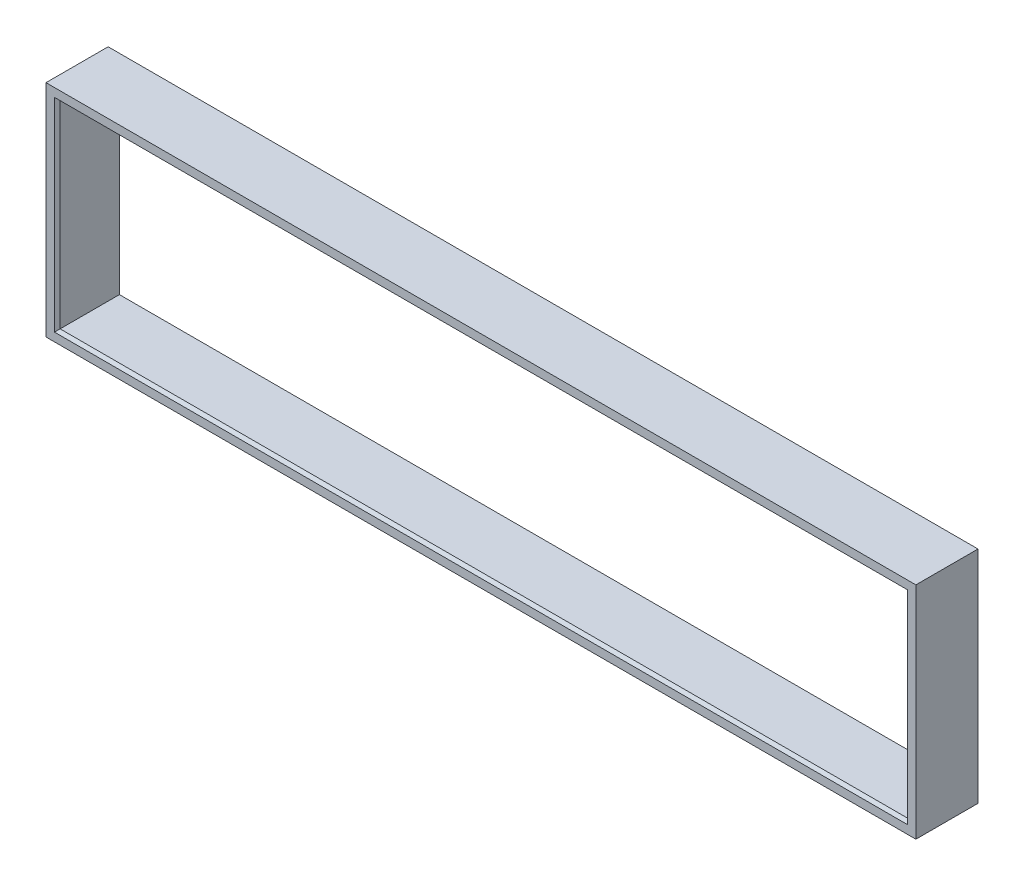
ISO-10303-21;
HEADER;
FILE_DESCRIPTION(('STEP AP214'),'2;1');
FILE_NAME('part.step','',(''),(''),'','','');
FILE_SCHEMA(('AUTOMOTIVE_DESIGN { 1 0 10303 214 1 1 1 1 }'));
ENDSEC;
DATA;
#1=APPLICATION_CONTEXT('core data for automotive mechanical design processes');
#2=APPLICATION_PROTOCOL_DEFINITION('international standard','automotive_design',2000,#1);
#3=PRODUCT_CONTEXT('',#1,'mechanical');
#4=PRODUCT('Part','Part','',(#3));
#5=PRODUCT_RELATED_PRODUCT_CATEGORY('part','',(#4));
#6=PRODUCT_DEFINITION_FORMATION('','',#4);
#7=PRODUCT_DEFINITION_CONTEXT('part definition',#1,'design');
#8=PRODUCT_DEFINITION('design','',#6,#7);
#9=PRODUCT_DEFINITION_SHAPE('','',#8);
#10=(LENGTH_UNIT() NAMED_UNIT(*) SI_UNIT(.MILLI.,.METRE.));
#11=(NAMED_UNIT(*) PLANE_ANGLE_UNIT() SI_UNIT($,.RADIAN.));
#12=(NAMED_UNIT(*) SI_UNIT($,.STERADIAN.) SOLID_ANGLE_UNIT());
#13=UNCERTAINTY_MEASURE_WITH_UNIT(LENGTH_MEASURE(1.E-05),#10,'distance_accuracy_value','');
#14=(GEOMETRIC_REPRESENTATION_CONTEXT(3) GLOBAL_UNCERTAINTY_ASSIGNED_CONTEXT((#13)) GLOBAL_UNIT_ASSIGNED_CONTEXT((#10,
#11,#12)) REPRESENTATION_CONTEXT('',''));
#15=CARTESIAN_POINT('',(0.,0.,0.));
#16=DIRECTION('',(0.,0.,1.));
#17=DIRECTION('',(1.,0.,0.));
#18=AXIS2_PLACEMENT_3D('',#15,#16,#17);
#19=CARTESIAN_POINT('',(-154.,39.,-20.));
#20=DIRECTION('',(-1.,0.,0.));
#21=DIRECTION('',(0.,0.,1.));
#22=AXIS2_PLACEMENT_3D('',#19,#20,#21);
#23=PLANE('',#22);
#24=DIRECTION('',(0.,0.,1.));
#25=VECTOR('',#24,1.);
#26=CARTESIAN_POINT('',(-154.,-39.,-20.));
#27=LINE('',#26,#25);
#28=CARTESIAN_POINT('',(-154.,-39.,-20.));
#29=VERTEX_POINT('',#28);
#30=CARTESIAN_POINT('',(-154.,-39.,2.));
#31=VERTEX_POINT('',#30);
#32=EDGE_CURVE('E113',#29,#31,#27,.T.);
#33=ORIENTED_EDGE('',*,*,#32,.T.);
#34=DIRECTION('',(0.,-1.,0.));
#35=VECTOR('',#34,1.);
#36=CARTESIAN_POINT('',(-154.,39.,2.));
#37=LINE('',#36,#35);
#38=CARTESIAN_POINT('',(-154.,39.,2.));
#39=VERTEX_POINT('',#38);
#40=EDGE_CURVE('E116',#39,#31,#37,.T.);
#41=ORIENTED_EDGE('',*,*,#40,.F.);
#42=DIRECTION('',(0.,0.,1.));
#43=VECTOR('',#42,1.);
#44=CARTESIAN_POINT('',(-154.,39.,-20.));
#45=LINE('',#44,#43);
#46=CARTESIAN_POINT('',(-154.,39.,-20.));
#47=VERTEX_POINT('',#46);
#48=EDGE_CURVE('E172',#47,#39,#45,.T.);
#49=ORIENTED_EDGE('',*,*,#48,.F.);
#50=DIRECTION('',(0.,-1.,0.));
#51=VECTOR('',#50,1.);
#52=CARTESIAN_POINT('',(-154.,39.,-20.));
#53=LINE('',#52,#51);
#54=EDGE_CURVE('E118',#47,#29,#53,.T.);
#55=ORIENTED_EDGE('',*,*,#54,.T.);
#56=EDGE_LOOP('',(#33,#41,#49,#55));
#57=FACE_BOUND('',#56,.T.);
#58=ADVANCED_FACE('F34',(#57),#23,.T.);
#59=CARTESIAN_POINT('',(-154.,39.,-20.));
#60=DIRECTION('',(0.,1.,0.));
#61=DIRECTION('',(0.,0.,1.));
#62=AXIS2_PLACEMENT_3D('',#59,#60,#61);
#63=PLANE('',#62);
#64=ORIENTED_EDGE('',*,*,#48,.T.);
#65=DIRECTION('',(-1.,0.,0.));
#66=VECTOR('',#65,1.);
#67=CARTESIAN_POINT('',(-154.,39.,2.));
#68=LINE('',#67,#66);
#69=CARTESIAN_POINT('',(154.,39.,2.));
#70=VERTEX_POINT('',#69);
#71=EDGE_CURVE('E136',#70,#39,#68,.T.);
#72=ORIENTED_EDGE('',*,*,#71,.F.);
#73=DIRECTION('',(0.,0.,1.));
#74=VECTOR('',#73,1.);
#75=CARTESIAN_POINT('',(154.,39.,-20.));
#76=LINE('',#75,#74);
#77=CARTESIAN_POINT('',(154.,39.,-20.));
#78=VERTEX_POINT('',#77);
#79=EDGE_CURVE('E175',#78,#70,#76,.T.);
#80=ORIENTED_EDGE('',*,*,#79,.F.);
#81=DIRECTION('',(-1.,0.,0.));
#82=VECTOR('',#81,1.);
#83=CARTESIAN_POINT('',(-154.,39.,-20.));
#84=LINE('',#83,#82);
#85=EDGE_CURVE('E123',#78,#47,#84,.T.);
#86=ORIENTED_EDGE('',*,*,#85,.T.);
#87=EDGE_LOOP('',(#64,#72,#80,#86));
#88=FACE_BOUND('',#87,.T.);
#89=ADVANCED_FACE('F232',(#88),#63,.T.);
#90=CARTESIAN_POINT('',(154.,39.,-20.));
#91=DIRECTION('',(1.,0.,0.));
#92=DIRECTION('',(0.,0.,-1.));
#93=AXIS2_PLACEMENT_3D('',#90,#91,#92);
#94=PLANE('',#93);
#95=ORIENTED_EDGE('',*,*,#79,.T.);
#96=DIRECTION('',(0.,1.,0.));
#97=VECTOR('',#96,1.);
#98=CARTESIAN_POINT('',(154.,39.,2.));
#99=LINE('',#98,#97);
#100=CARTESIAN_POINT('',(154.,-39.,2.));
#101=VERTEX_POINT('',#100);
#102=EDGE_CURVE('E131',#101,#70,#99,.T.);
#103=ORIENTED_EDGE('',*,*,#102,.F.);
#104=DIRECTION('',(0.,0.,1.));
#105=VECTOR('',#104,1.);
#106=CARTESIAN_POINT('',(154.,-39.,-20.));
#107=LINE('',#106,#105);
#108=CARTESIAN_POINT('',(154.,-39.,-20.));
#109=VERTEX_POINT('',#108);
#110=EDGE_CURVE('E122',#109,#101,#107,.T.);
#111=ORIENTED_EDGE('',*,*,#110,.F.);
#112=DIRECTION('',(0.,1.,0.));
#113=VECTOR('',#112,1.);
#114=CARTESIAN_POINT('',(154.,39.,-20.));
#115=LINE('',#114,#113);
#116=EDGE_CURVE('E167',#109,#78,#115,.T.);
#117=ORIENTED_EDGE('',*,*,#116,.T.);
#118=EDGE_LOOP('',(#95,#103,#111,#117));
#119=FACE_BOUND('',#118,.T.);
#120=ADVANCED_FACE('F237',(#119),#94,.T.);
#121=CARTESIAN_POINT('',(-154.,-39.,-20.));
#122=DIRECTION('',(0.,-1.,0.));
#123=DIRECTION('',(0.,0.,-1.));
#124=AXIS2_PLACEMENT_3D('',#121,#122,#123);
#125=PLANE('',#124);
#126=ORIENTED_EDGE('',*,*,#110,.T.);
#127=DIRECTION('',(1.,0.,0.));
#128=VECTOR('',#127,1.);
#129=CARTESIAN_POINT('',(-154.,-39.,2.));
#130=LINE('',#129,#128);
#131=EDGE_CURVE('E126',#31,#101,#130,.T.);
#132=ORIENTED_EDGE('',*,*,#131,.F.);
#133=ORIENTED_EDGE('',*,*,#32,.F.);
#134=DIRECTION('',(1.,0.,0.));
#135=VECTOR('',#134,1.);
#136=CARTESIAN_POINT('',(-154.,-39.,-20.));
#137=LINE('',#136,#135);
#138=EDGE_CURVE('E165',#29,#109,#137,.T.);
#139=ORIENTED_EDGE('',*,*,#138,.T.);
#140=EDGE_LOOP('',(#126,#132,#133,#139));
#141=FACE_BOUND('',#140,.T.);
#142=ADVANCED_FACE('F127',(#141),#125,.T.);
#143=CARTESIAN_POINT('',(0.,0.,-20.));
#144=DIRECTION('',(0.,0.,1.));
#145=DIRECTION('',(1.,0.,0.));
#146=AXIS2_PLACEMENT_3D('',#143,#144,#145);
#147=PLANE('',#146);
#148=DIRECTION('',(-1.,0.,0.));
#149=VECTOR('',#148,1.);
#150=CARTESIAN_POINT('',(-150.,35.,-20.));
#151=LINE('',#150,#149);
#152=CARTESIAN_POINT('',(150.,35.,-20.));
#153=VERTEX_POINT('',#152);
#154=CARTESIAN_POINT('',(-150.,35.,-20.));
#155=VERTEX_POINT('',#154);
#156=EDGE_CURVE('E152',#153,#155,#151,.T.);
#157=ORIENTED_EDGE('',*,*,#156,.T.);
#158=DIRECTION('',(0.,-1.,0.));
#159=VECTOR('',#158,1.);
#160=CARTESIAN_POINT('',(-150.,35.,-20.));
#161=LINE('',#160,#159);
#162=CARTESIAN_POINT('',(-150.,-35.,-20.));
#163=VERTEX_POINT('',#162);
#164=EDGE_CURVE('E143',#155,#163,#161,.T.);
#165=ORIENTED_EDGE('',*,*,#164,.T.);
#166=DIRECTION('',(1.,0.,0.));
#167=VECTOR('',#166,1.);
#168=CARTESIAN_POINT('',(-150.,-35.,-20.));
#169=LINE('',#168,#167);
#170=CARTESIAN_POINT('',(150.,-35.,-20.));
#171=VERTEX_POINT('',#170);
#172=EDGE_CURVE('E146',#163,#171,#169,.T.);
#173=ORIENTED_EDGE('',*,*,#172,.T.);
#174=DIRECTION('',(0.,1.,0.));
#175=VECTOR('',#174,1.);
#176=CARTESIAN_POINT('',(150.,35.,-20.));
#177=LINE('',#176,#175);
#178=EDGE_CURVE('E149',#171,#153,#177,.T.);
#179=ORIENTED_EDGE('',*,*,#178,.T.);
#180=EDGE_LOOP('',(#157,#165,#173,#179));
#181=FACE_BOUND('',#180,.T.);
#182=ORIENTED_EDGE('',*,*,#54,.F.);
#183=ORIENTED_EDGE('',*,*,#85,.F.);
#184=ORIENTED_EDGE('',*,*,#116,.F.);
#185=ORIENTED_EDGE('',*,*,#138,.F.);
#186=EDGE_LOOP('',(#182,#183,#184,#185));
#187=FACE_BOUND('',#186,.T.);
#188=ADVANCED_FACE('F217',(#181,#187),#147,.F.);
#189=CARTESIAN_POINT('',(-150.,35.,-20.));
#190=DIRECTION('',(-1.,0.,0.));
#191=DIRECTION('',(0.,0.,1.));
#192=AXIS2_PLACEMENT_3D('',#189,#190,#191);
#193=PLANE('',#192);
#194=DIRECTION('',(0.,0.,1.));
#195=VECTOR('',#194,1.);
#196=CARTESIAN_POINT('',(-150.,35.,-20.));
#197=LINE('',#196,#195);
#198=CARTESIAN_POINT('',(-150.,35.,0.99999999999997));
#199=VERTEX_POINT('',#198);
#200=EDGE_CURVE('E156',#155,#199,#197,.T.);
#201=ORIENTED_EDGE('',*,*,#200,.T.);
#202=DIRECTION('',(0.,-1.,0.));
#203=VECTOR('',#202,1.);
#204=CARTESIAN_POINT('',(-150.,-35.,0.99999999999997));
#205=LINE('',#204,#203);
#206=CARTESIAN_POINT('',(-150.,-35.,0.99999999999997));
#207=VERTEX_POINT('',#206);
#208=EDGE_CURVE('E174',#199,#207,#205,.T.);
#209=ORIENTED_EDGE('',*,*,#208,.T.);
#210=DIRECTION('',(0.,0.,1.));
#211=VECTOR('',#210,1.);
#212=CARTESIAN_POINT('',(-150.,-35.,-20.));
#213=LINE('',#212,#211);
#214=EDGE_CURVE('E155',#163,#207,#213,.T.);
#215=ORIENTED_EDGE('',*,*,#214,.F.);
#216=ORIENTED_EDGE('',*,*,#164,.F.);
#217=EDGE_LOOP('',(#201,#209,#215,#216));
#218=FACE_BOUND('',#217,.T.);
#219=ADVANCED_FACE('F214',(#218),#193,.F.);
#220=CARTESIAN_POINT('',(-150.,35.,-20.));
#221=DIRECTION('',(0.,1.,0.));
#222=DIRECTION('',(0.,0.,1.));
#223=AXIS2_PLACEMENT_3D('',#220,#221,#222);
#224=PLANE('',#223);
#225=DIRECTION('',(0.,0.,1.));
#226=VECTOR('',#225,1.);
#227=CARTESIAN_POINT('',(150.,35.,-20.));
#228=LINE('',#227,#226);
#229=CARTESIAN_POINT('',(150.,35.,0.99999999999997));
#230=VERTEX_POINT('',#229);
#231=EDGE_CURVE('E159',#153,#230,#228,.T.);
#232=ORIENTED_EDGE('',*,*,#231,.T.);
#233=DIRECTION('',(-1.,0.,0.));
#234=VECTOR('',#233,1.);
#235=CARTESIAN_POINT('',(-150.,35.,0.99999999999997));
#236=LINE('',#235,#234);
#237=EDGE_CURVE('E11',#230,#199,#236,.T.);
#238=ORIENTED_EDGE('',*,*,#237,.T.);
#239=ORIENTED_EDGE('',*,*,#200,.F.);
#240=ORIENTED_EDGE('',*,*,#156,.F.);
#241=EDGE_LOOP('',(#232,#238,#239,#240));
#242=FACE_BOUND('',#241,.T.);
#243=ADVANCED_FACE('F210',(#242),#224,.F.);
#244=CARTESIAN_POINT('',(150.,35.,-20.));
#245=DIRECTION('',(1.,0.,0.));
#246=DIRECTION('',(0.,0.,-1.));
#247=AXIS2_PLACEMENT_3D('',#244,#245,#246);
#248=PLANE('',#247);
#249=DIRECTION('',(0.,0.,1.));
#250=VECTOR('',#249,1.);
#251=CARTESIAN_POINT('',(150.,-35.,-20.));
#252=LINE('',#251,#250);
#253=CARTESIAN_POINT('',(150.,-35.,0.99999999999997));
#254=VERTEX_POINT('',#253);
#255=EDGE_CURVE('E161',#171,#254,#252,.T.);
#256=ORIENTED_EDGE('',*,*,#255,.T.);
#257=DIRECTION('',(0.,1.,0.));
#258=VECTOR('',#257,1.);
#259=CARTESIAN_POINT('',(150.,35.,0.99999999999997));
#260=LINE('',#259,#258);
#261=EDGE_CURVE('E43',#254,#230,#260,.T.);
#262=ORIENTED_EDGE('',*,*,#261,.T.);
#263=ORIENTED_EDGE('',*,*,#231,.F.);
#264=ORIENTED_EDGE('',*,*,#178,.F.);
#265=EDGE_LOOP('',(#256,#262,#263,#264));
#266=FACE_BOUND('',#265,.T.);
#267=ADVANCED_FACE('F219',(#266),#248,.F.);
#268=CARTESIAN_POINT('',(-150.,-35.,-20.));
#269=DIRECTION('',(0.,-1.,0.));
#270=DIRECTION('',(0.,0.,-1.));
#271=AXIS2_PLACEMENT_3D('',#268,#269,#270);
#272=PLANE('',#271);
#273=ORIENTED_EDGE('',*,*,#214,.T.);
#274=DIRECTION('',(1.,0.,0.));
#275=VECTOR('',#274,1.);
#276=CARTESIAN_POINT('',(150.,-35.,0.99999999999997));
#277=LINE('',#276,#275);
#278=EDGE_CURVE('E58',#207,#254,#277,.T.);
#279=ORIENTED_EDGE('',*,*,#278,.T.);
#280=ORIENTED_EDGE('',*,*,#255,.F.);
#281=ORIENTED_EDGE('',*,*,#172,.F.);
#282=EDGE_LOOP('',(#273,#279,#280,#281));
#283=FACE_BOUND('',#282,.T.);
#284=ADVANCED_FACE('F220',(#283),#272,.F.);
#285=CARTESIAN_POINT('',(0.,0.,2.));
#286=DIRECTION('',(0.,0.,1.));
#287=DIRECTION('',(1.,0.,0.));
#288=AXIS2_PLACEMENT_3D('',#285,#286,#287);
#289=PLANE('',#288);
#290=DIRECTION('',(-1.,0.,0.));
#291=VECTOR('',#290,1.);
#292=CARTESIAN_POINT('',(-150.,-36.,2.));
#293=LINE('',#292,#291);
#294=CARTESIAN_POINT('',(151.,-36.,2.));
#295=VERTEX_POINT('',#294);
#296=CARTESIAN_POINT('',(-151.,-36.,2.));
#297=VERTEX_POINT('',#296);
#298=EDGE_CURVE('E184',#295,#297,#293,.T.);
#299=ORIENTED_EDGE('',*,*,#298,.T.);
#300=DIRECTION('',(0.,1.,0.));
#301=VECTOR('',#300,1.);
#302=CARTESIAN_POINT('',(-151.,35.,2.));
#303=LINE('',#302,#301);
#304=CARTESIAN_POINT('',(-151.,36.0000000000001,2.));
#305=VERTEX_POINT('',#304);
#306=EDGE_CURVE('E186',#297,#305,#303,.T.);
#307=ORIENTED_EDGE('',*,*,#306,.T.);
#308=DIRECTION('',(1.,0.,0.));
#309=VECTOR('',#308,1.);
#310=CARTESIAN_POINT('',(150.,36.0000000000001,2.));
#311=LINE('',#310,#309);
#312=CARTESIAN_POINT('',(151.,36.0000000000001,2.));
#313=VERTEX_POINT('',#312);
#314=EDGE_CURVE('E180',#305,#313,#311,.T.);
#315=ORIENTED_EDGE('',*,*,#314,.T.);
#316=DIRECTION('',(0.,-1.,0.));
#317=VECTOR('',#316,1.);
#318=CARTESIAN_POINT('',(151.,-35.,2.));
#319=LINE('',#318,#317);
#320=EDGE_CURVE('E182',#313,#295,#319,.T.);
#321=ORIENTED_EDGE('',*,*,#320,.T.);
#322=EDGE_LOOP('',(#299,#307,#315,#321));
#323=FACE_BOUND('',#322,.T.);
#324=ORIENTED_EDGE('',*,*,#40,.T.);
#325=ORIENTED_EDGE('',*,*,#131,.T.);
#326=ORIENTED_EDGE('',*,*,#102,.T.);
#327=ORIENTED_EDGE('',*,*,#71,.T.);
#328=EDGE_LOOP('',(#324,#325,#326,#327));
#329=FACE_BOUND('',#328,.T.);
#330=ADVANCED_FACE('F134',(#323,#329),#289,.T.);
#331=CARTESIAN_POINT('',(150.,35.,0.99999999999997));
#332=DIRECTION('',(-0.707106781186538,0.,0.707106781186557));
#333=DIRECTION('',(0.,-1.,0.));
#334=AXIS2_PLACEMENT_3D('',#331,#332,#333);
#335=PLANE('',#334);
#336=DIRECTION('',(0.577350269189631,-0.577350269189631,0.577350269189616));
#337=VECTOR('',#336,1.);
#338=CARTESIAN_POINT('',(49.9999999999983,65.0000000000017,-98.9999999999992));
#339=LINE('',#338,#337);
#340=EDGE_CURVE('E139',#295,#254,#339,.F.);
#341=ORIENTED_EDGE('',*,*,#340,.F.);
#342=ORIENTED_EDGE('',*,*,#320,.F.);
#343=DIRECTION('',(0.577350269189631,0.577350269189631,0.577350269189616));
#344=VECTOR('',#343,1.);
#345=CARTESIAN_POINT('',(150.,35.,0.99999999999997));
#346=LINE('',#345,#344);
#347=EDGE_CURVE('E38',#230,#313,#346,.T.);
#348=ORIENTED_EDGE('',*,*,#347,.F.);
#349=ORIENTED_EDGE('',*,*,#261,.F.);
#350=EDGE_LOOP('',(#341,#342,#348,#349));
#351=FACE_BOUND('',#350,.T.);
#352=ADVANCED_FACE('F36',(#351),#335,.T.);
#353=CARTESIAN_POINT('',(-150.,35.,0.99999999999997));
#354=DIRECTION('',(0.,-0.707106781186538,0.707106781186557));
#355=DIRECTION('',(1.,0.,0.));
#356=AXIS2_PLACEMENT_3D('',#353,#354,#355);
#357=PLANE('',#356);
#358=ORIENTED_EDGE('',*,*,#347,.T.);
#359=ORIENTED_EDGE('',*,*,#314,.F.);
#360=DIRECTION('',(0.577350269189631,-0.577350269189631,-0.577350269189616));
#361=VECTOR('',#360,1.);
#362=CARTESIAN_POINT('',(-150.,35.,0.99999999999997));
#363=LINE('',#362,#361);
#364=EDGE_CURVE('E193',#199,#305,#363,.F.);
#365=ORIENTED_EDGE('',*,*,#364,.F.);
#366=ORIENTED_EDGE('',*,*,#237,.F.);
#367=EDGE_LOOP('',(#358,#359,#365,#366));
#368=FACE_BOUND('',#367,.T.);
#369=ADVANCED_FACE('F207',(#368),#357,.T.);
#370=CARTESIAN_POINT('',(-150.,-35.,0.99999999999997));
#371=DIRECTION('',(0.,0.707106781186538,0.707106781186557));
#372=DIRECTION('',(-1.,0.,0.));
#373=AXIS2_PLACEMENT_3D('',#370,#371,#372);
#374=PLANE('',#373);
#375=ORIENTED_EDGE('',*,*,#340,.T.);
#376=ORIENTED_EDGE('',*,*,#278,.F.);
#377=DIRECTION('',(-0.577350269189631,-0.577350269189631,0.577350269189616));
#378=VECTOR('',#377,1.);
#379=CARTESIAN_POINT('',(-126.666666666666,-11.6666666666662,-22.3333333333332));
#380=LINE('',#379,#378);
#381=EDGE_CURVE('E191',#297,#207,#380,.F.);
#382=ORIENTED_EDGE('',*,*,#381,.F.);
#383=ORIENTED_EDGE('',*,*,#298,.F.);
#384=EDGE_LOOP('',(#375,#376,#382,#383));
#385=FACE_BOUND('',#384,.T.);
#386=ADVANCED_FACE('F198',(#385),#374,.T.);
#387=CARTESIAN_POINT('',(-150.,35.,0.99999999999997));
#388=DIRECTION('',(0.707106781186538,0.,0.707106781186557));
#389=DIRECTION('',(0.,1.,0.));
#390=AXIS2_PLACEMENT_3D('',#387,#388,#389);
#391=PLANE('',#390);
#392=ORIENTED_EDGE('',*,*,#364,.T.);
#393=ORIENTED_EDGE('',*,*,#306,.F.);
#394=ORIENTED_EDGE('',*,*,#381,.T.);
#395=ORIENTED_EDGE('',*,*,#208,.F.);
#396=EDGE_LOOP('',(#392,#393,#394,#395));
#397=FACE_BOUND('',#396,.T.);
#398=ADVANCED_FACE('F243',(#397),#391,.T.);
#399=CLOSED_SHELL('',(#58,#89,#120,#142,#188,#219,#243,#267,#284,#330,#352,#369,#386,#398));
#400=MANIFOLD_SOLID_BREP('B2',#399);
#401=ADVANCED_BREP_SHAPE_REPRESENTATION('',(#18,#400),#14);
#402=SHAPE_DEFINITION_REPRESENTATION(#9,#401);
ENDSEC;
END-ISO-10303-21;
